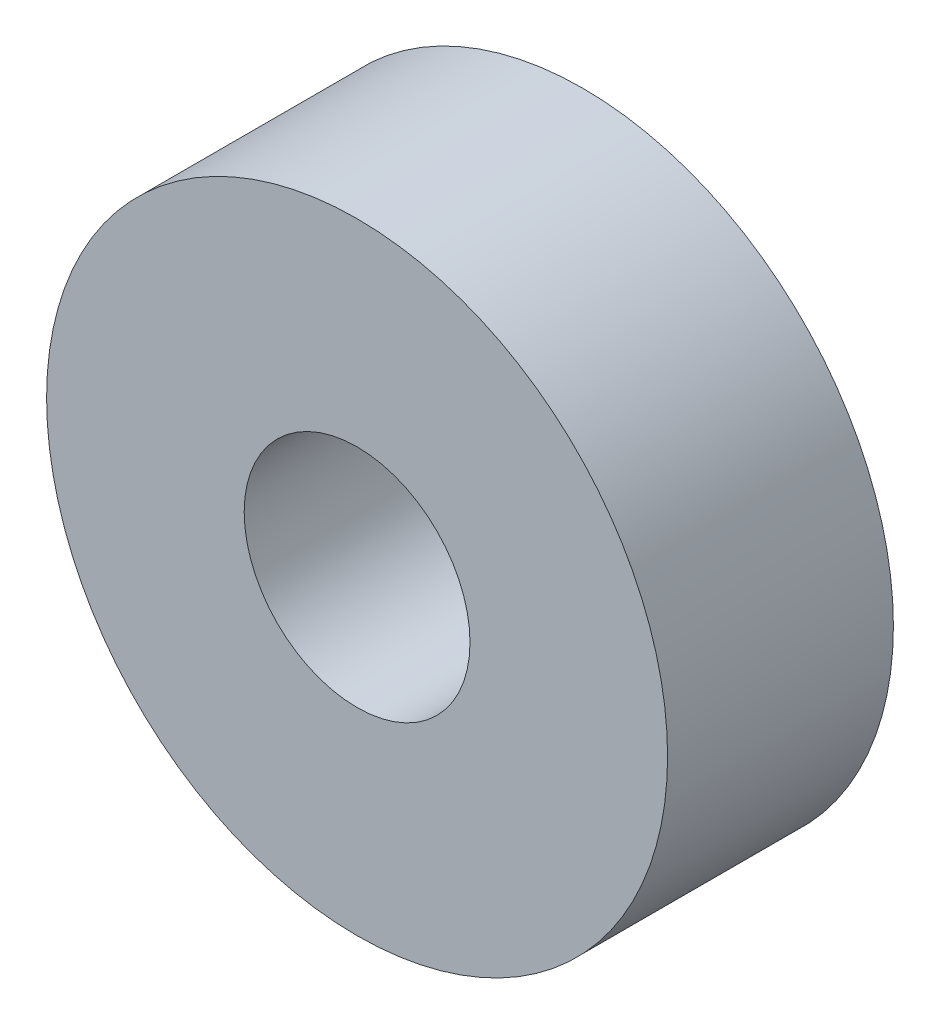
ISO-10303-21;
HEADER;
FILE_DESCRIPTION(('STEP AP214'),'2;1');
FILE_NAME('part.step','',(''),(''),'','','');
FILE_SCHEMA(('AUTOMOTIVE_DESIGN { 1 0 10303 214 1 1 1 1 }'));
ENDSEC;
DATA;
#1=APPLICATION_CONTEXT('core data for automotive mechanical design processes');
#2=APPLICATION_PROTOCOL_DEFINITION('international standard','automotive_design',2000,#1);
#3=PRODUCT_CONTEXT('',#1,'mechanical');
#4=PRODUCT('Part','Part','',(#3));
#5=PRODUCT_RELATED_PRODUCT_CATEGORY('part','',(#4));
#6=PRODUCT_DEFINITION_FORMATION('','',#4);
#7=PRODUCT_DEFINITION_CONTEXT('part definition',#1,'design');
#8=PRODUCT_DEFINITION('design','',#6,#7);
#9=PRODUCT_DEFINITION_SHAPE('','',#8);
#10=(LENGTH_UNIT() NAMED_UNIT(*) SI_UNIT(.MILLI.,.METRE.));
#11=(NAMED_UNIT(*) PLANE_ANGLE_UNIT() SI_UNIT($,.RADIAN.));
#12=(NAMED_UNIT(*) SI_UNIT($,.STERADIAN.) SOLID_ANGLE_UNIT());
#13=UNCERTAINTY_MEASURE_WITH_UNIT(LENGTH_MEASURE(1.E-05),#10,'distance_accuracy_value','');
#14=(GEOMETRIC_REPRESENTATION_CONTEXT(3) GLOBAL_UNCERTAINTY_ASSIGNED_CONTEXT((#13)) GLOBAL_UNIT_ASSIGNED_CONTEXT((#10,
#11,#12)) REPRESENTATION_CONTEXT('',''));
#15=CARTESIAN_POINT('',(0.,0.,0.));
#16=DIRECTION('',(0.,0.,1.));
#17=DIRECTION('',(1.,0.,0.));
#18=AXIS2_PLACEMENT_3D('',#15,#16,#17);
#19=CARTESIAN_POINT('',(0.,0.,4.));
#20=DIRECTION('',(0.,0.,1.));
#21=DIRECTION('',(1.,0.,0.));
#22=AXIS2_PLACEMENT_3D('',#19,#20,#21);
#23=PLANE('',#22);
#24=CARTESIAN_POINT('',(0.,0.,4.));
#25=DIRECTION('',(0.,0.,1.));
#26=DIRECTION('',(1.,0.,0.));
#27=AXIS2_PLACEMENT_3D('',#24,#25,#26);
#28=CIRCLE('',#27,5.5);
#29=CARTESIAN_POINT('',(5.5,0.,4.));
#30=VERTEX_POINT('',#29);
#31=EDGE_CURVE('E10',#30,#30,#28,.T.);
#32=ORIENTED_EDGE('',*,*,#31,.T.);
#33=EDGE_LOOP('',(#32));
#34=FACE_BOUND('',#33,.T.);
#35=CARTESIAN_POINT('',(0.,0.,4.));
#36=DIRECTION('',(0.,0.,1.));
#37=DIRECTION('',(1.,0.,0.));
#38=AXIS2_PLACEMENT_3D('',#35,#36,#37);
#39=CIRCLE('',#38,2.);
#40=CARTESIAN_POINT('',(2.,0.,4.));
#41=VERTEX_POINT('',#40);
#42=EDGE_CURVE('E44',#41,#41,#39,.T.);
#43=ORIENTED_EDGE('',*,*,#42,.F.);
#44=EDGE_LOOP('',(#43));
#45=FACE_BOUND('',#44,.T.);
#46=ADVANCED_FACE('F33',(#34,#45),#23,.T.);
#47=CARTESIAN_POINT('',(0.,0.,0.));
#48=DIRECTION('',(0.,0.,1.));
#49=DIRECTION('',(1.,0.,0.));
#50=AXIS2_PLACEMENT_3D('',#47,#48,#49);
#51=PLANE('',#50);
#52=CARTESIAN_POINT('',(0.,0.,0.));
#53=DIRECTION('',(0.,0.,1.));
#54=DIRECTION('',(1.,0.,0.));
#55=AXIS2_PLACEMENT_3D('',#52,#53,#54);
#56=CIRCLE('',#55,5.5);
#57=CARTESIAN_POINT('',(5.5,0.,0.));
#58=VERTEX_POINT('',#57);
#59=EDGE_CURVE('E37',#58,#58,#56,.T.);
#60=ORIENTED_EDGE('',*,*,#59,.F.);
#61=EDGE_LOOP('',(#60));
#62=FACE_BOUND('',#61,.T.);
#63=CARTESIAN_POINT('',(0.,0.,0.));
#64=DIRECTION('',(0.,0.,1.));
#65=DIRECTION('',(1.,0.,0.));
#66=AXIS2_PLACEMENT_3D('',#63,#64,#65);
#67=CIRCLE('',#66,2.);
#68=CARTESIAN_POINT('',(2.,0.,0.));
#69=VERTEX_POINT('',#68);
#70=EDGE_CURVE('E46',#69,#69,#67,.T.);
#71=ORIENTED_EDGE('',*,*,#70,.T.);
#72=EDGE_LOOP('',(#71));
#73=FACE_BOUND('',#72,.T.);
#74=ADVANCED_FACE('F56',(#62,#73),#51,.F.);
#75=CARTESIAN_POINT('',(0.,0.,4.));
#76=DIRECTION('',(0.,0.,-1.));
#77=DIRECTION('',(-1.,0.,0.));
#78=AXIS2_PLACEMENT_3D('',#75,#76,#77);
#79=CYLINDRICAL_SURFACE('',#78,5.5);
#80=ORIENTED_EDGE('',*,*,#31,.F.);
#81=EDGE_LOOP('',(#80));
#82=FACE_BOUND('',#81,.T.);
#83=ORIENTED_EDGE('',*,*,#59,.T.);
#84=EDGE_LOOP('',(#83));
#85=FACE_BOUND('',#84,.T.);
#86=ADVANCED_FACE('F35',(#82,#85),#79,.T.);
#87=CARTESIAN_POINT('',(0.,0.,4.));
#88=DIRECTION('',(0.,0.,-1.));
#89=DIRECTION('',(-1.,0.,0.));
#90=AXIS2_PLACEMENT_3D('',#87,#88,#89);
#91=CYLINDRICAL_SURFACE('',#90,2.);
#92=ORIENTED_EDGE('',*,*,#42,.T.);
#93=EDGE_LOOP('',(#92));
#94=FACE_BOUND('',#93,.T.);
#95=ORIENTED_EDGE('',*,*,#70,.F.);
#96=EDGE_LOOP('',(#95));
#97=FACE_BOUND('',#96,.T.);
#98=ADVANCED_FACE('F52',(#94,#97),#91,.F.);
#99=CLOSED_SHELL('',(#46,#74,#86,#98));
#100=MANIFOLD_SOLID_BREP('B2',#99);
#101=ADVANCED_BREP_SHAPE_REPRESENTATION('',(#18,#100),#14);
#102=SHAPE_DEFINITION_REPRESENTATION(#9,#101);
ENDSEC;
END-ISO-10303-21;
